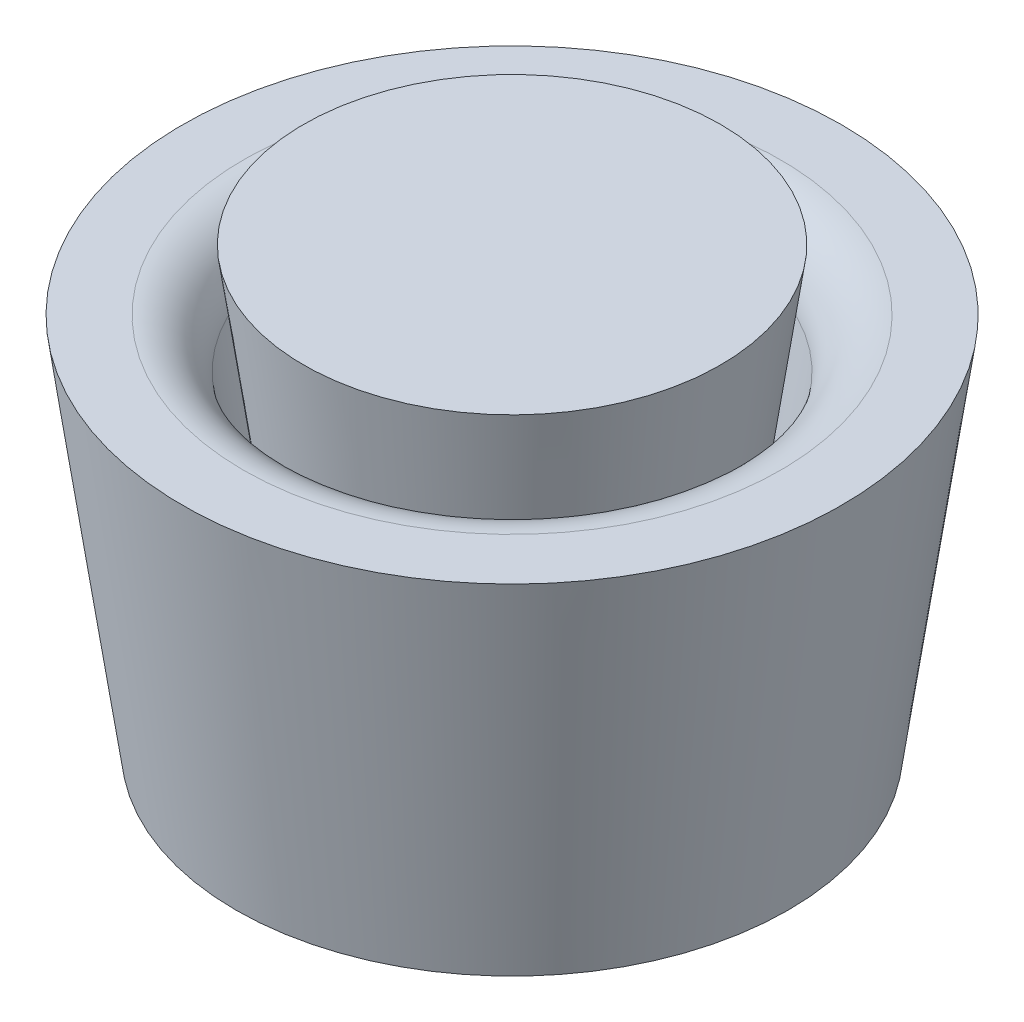
ISO-10303-21;
HEADER;
FILE_DESCRIPTION(('STEP AP214'),'2;1');
FILE_NAME('part.step','',(''),(''),'','','');
FILE_SCHEMA(('AUTOMOTIVE_DESIGN { 1 0 10303 214 1 1 1 1 }'));
ENDSEC;
DATA;
#1=APPLICATION_CONTEXT('core data for automotive mechanical design processes');
#2=APPLICATION_PROTOCOL_DEFINITION('international standard','automotive_design',2000,#1);
#3=PRODUCT_CONTEXT('',#1,'mechanical');
#4=PRODUCT('Part','Part','',(#3));
#5=PRODUCT_RELATED_PRODUCT_CATEGORY('part','',(#4));
#6=PRODUCT_DEFINITION_FORMATION('','',#4);
#7=PRODUCT_DEFINITION_CONTEXT('part definition',#1,'design');
#8=PRODUCT_DEFINITION('design','',#6,#7);
#9=PRODUCT_DEFINITION_SHAPE('','',#8);
#10=(LENGTH_UNIT() NAMED_UNIT(*) SI_UNIT(.MILLI.,.METRE.));
#11=(NAMED_UNIT(*) PLANE_ANGLE_UNIT() SI_UNIT($,.RADIAN.));
#12=(NAMED_UNIT(*) SI_UNIT($,.STERADIAN.) SOLID_ANGLE_UNIT());
#13=UNCERTAINTY_MEASURE_WITH_UNIT(LENGTH_MEASURE(1.E-05),#10,'distance_accuracy_value','');
#14=(GEOMETRIC_REPRESENTATION_CONTEXT(3) GLOBAL_UNCERTAINTY_ASSIGNED_CONTEXT((#13)) GLOBAL_UNIT_ASSIGNED_CONTEXT((#10,
#11,#12)) REPRESENTATION_CONTEXT('',''));
#15=CARTESIAN_POINT('',(0.,0.,0.));
#16=DIRECTION('',(0.,0.,1.));
#17=DIRECTION('',(1.,0.,0.));
#18=AXIS2_PLACEMENT_3D('',#15,#16,#17);
#19=CARTESIAN_POINT('',(0.,23.,0.));
#20=DIRECTION('',(0.,1.,0.));
#21=DIRECTION('',(0.,0.,1.));
#22=AXIS2_PLACEMENT_3D('',#19,#20,#21);
#23=PLANE('',#22);
#24=CARTESIAN_POINT('',(0.,23.,0.));
#25=DIRECTION('',(0.,-1.,0.));
#26=DIRECTION('',(0.,0.,-1.));
#27=AXIS2_PLACEMENT_3D('',#24,#25,#26);
#28=CIRCLE('',#27,10.9420811280098);
#29=CARTESIAN_POINT('',(0.,23.,-10.9420811280098));
#30=VERTEX_POINT('',#29);
#31=EDGE_CURVE('E11',#30,#30,#28,.T.);
#32=ORIENTED_EDGE('',*,*,#31,.F.);
#33=EDGE_LOOP('',(#32));
#34=FACE_BOUND('',#33,.T.);
#35=ADVANCED_FACE('F41',(#34),#23,.T.);
#36=CARTESIAN_POINT('',(0.,3.,0.));
#37=DIRECTION('',(0.,1.,0.));
#38=DIRECTION('',(0.,0.,1.));
#39=AXIS2_PLACEMENT_3D('',#36,#37,#38);
#40=CONICAL_SURFACE('',#39,8.11423105664609,0.140461414709856);
#41=ORIENTED_EDGE('',*,*,#31,.T.);
#42=EDGE_LOOP('',(#41));
#43=FACE_BOUND('',#42,.T.);
#44=CARTESIAN_POINT('',(0.,3.,0.));
#45=DIRECTION('',(0.,-1.,0.));
#46=DIRECTION('',(0.,0.,-1.));
#47=AXIS2_PLACEMENT_3D('',#44,#45,#46);
#48=CIRCLE('',#47,8.11423105664609);
#49=CARTESIAN_POINT('',(0.,3.,-8.11423105664609));
#50=VERTEX_POINT('',#49);
#51=EDGE_CURVE('E47',#50,#50,#48,.T.);
#52=ORIENTED_EDGE('',*,*,#51,.F.);
#53=EDGE_LOOP('',(#52));
#54=FACE_BOUND('',#53,.T.);
#55=ADVANCED_FACE('F55',(#43,#54),#40,.T.);
#56=CARTESIAN_POINT('',(8.11423105664609,3.,0.));
#57=DIRECTION('',(0.,-1.,0.));
#58=DIRECTION('',(0.,0.,-1.));
#59=AXIS2_PLACEMENT_3D('',#56,#57,#58);
#60=PLANE('',#59);
#61=ORIENTED_EDGE('',*,*,#51,.T.);
#62=EDGE_LOOP('',(#61));
#63=FACE_BOUND('',#62,.T.);
#64=ADVANCED_FACE('F53',(#63),#60,.T.);
#65=CLOSED_SHELL('',(#35,#55,#64));
#66=MANIFOLD_SOLID_BREP('B2',#65);
#67=CARTESIAN_POINT('',(0.,0.,0.));
#68=DIRECTION('',(0.,-1.,0.));
#69=DIRECTION('',(0.,0.,-1.));
#70=AXIS2_PLACEMENT_3D('',#67,#68,#69);
#71=CYLINDRICAL_SURFACE('',#70,8.7);
#72=DIRECTION('',(0.,-1.,0.));
#73=VECTOR('',#72,1.);
#74=CARTESIAN_POINT('',(6.15182899632295,0.,-6.15182899632297));
#75=LINE('',#74,#73);
#76=CARTESIAN_POINT('',(6.15182899632295,-0.799999999999999,-6.15182899632297));
#77=VERTEX_POINT('',#76);
#78=CARTESIAN_POINT('',(6.15182899632295,-0.351732015752676,-6.15182899632297));
#79=VERTEX_POINT('',#78);
#80=EDGE_CURVE('E206',#77,#79,#75,.F.);
#81=ORIENTED_EDGE('',*,*,#80,.F.);
#82=CARTESIAN_POINT('',(0.,-0.8,0.));
#83=DIRECTION('',(0.,-1.,0.));
#84=DIRECTION('',(0.,0.,-1.));
#85=AXIS2_PLACEMENT_3D('',#82,#83,#84);
#86=CIRCLE('',#85,8.7);
#87=CARTESIAN_POINT('',(6.15182899632299,-0.799999999999999,6.15182899632293));
#88=VERTEX_POINT('',#87);
#89=EDGE_CURVE('E166',#77,#88,#86,.T.);
#90=ORIENTED_EDGE('',*,*,#89,.T.);
#91=DIRECTION('',(0.,-1.,0.));
#92=VECTOR('',#91,1.);
#93=CARTESIAN_POINT('',(6.15182899632299,0.,6.15182899632293));
#94=LINE('',#93,#92);
#95=CARTESIAN_POINT('',(6.15182899632299,-0.351732015752676,6.15182899632293));
#96=VERTEX_POINT('',#95);
#97=EDGE_CURVE('E147',#96,#88,#94,.T.);
#98=ORIENTED_EDGE('',*,*,#97,.F.);
#99=CARTESIAN_POINT('',(0.,-0.351732015752676,0.));
#100=DIRECTION('',(0.,1.,0.));
#101=DIRECTION('',(0.,0.,1.));
#102=AXIS2_PLACEMENT_3D('',#99,#100,#101);
#103=CIRCLE('',#102,8.7);
#104=EDGE_CURVE('E187',#96,#79,#103,.T.);
#105=ORIENTED_EDGE('',*,*,#104,.T.);
#106=EDGE_LOOP('',(#81,#90,#98,#105));
#107=FACE_BOUND('',#106,.T.);
#108=ADVANCED_FACE('F82',(#107),#71,.F.);
#109=CARTESIAN_POINT('',(0.,19.8030300711785,0.));
#110=DIRECTION('',(0.,1.,0.));
#111=DIRECTION('',(0.,0.,1.));
#112=AXIS2_PLACEMENT_3D('',#109,#110,#111);
#113=CONICAL_SURFACE('',#112,11.5,0.140461414709856);
#114=DIRECTION('',(-0.0989949493661173,-0.990151503558925,-0.0989949493661162));
#115=VECTOR('',#114,1.);
#116=CARTESIAN_POINT('',(0.,-61.5308434354474,0.));
#117=LINE('',#116,#115);
#118=CARTESIAN_POINT('',(6.9264325798115,7.74761649724918,6.92643257981143));
#119=VERTEX_POINT('',#118);
#120=CARTESIAN_POINT('',(6.18664868941287,0.348267984247336,6.18664868941281));
#121=VERTEX_POINT('',#120);
#122=EDGE_CURVE('E97',#119,#121,#117,.T.);
#123=ORIENTED_EDGE('',*,*,#122,.F.);
#124=CARTESIAN_POINT('',(0.,7.74761649724918,0.));
#125=DIRECTION('',(0.,1.,0.));
#126=DIRECTION('',(0.,0.,1.));
#127=AXIS2_PLACEMENT_3D('',#124,#125,#126);
#128=CIRCLE('',#127,9.79545489323224);
#129=CARTESIAN_POINT('',(6.92643257981145,7.7476164972492,-6.92643257981148));
#130=VERTEX_POINT('',#129);
#131=EDGE_CURVE('E197',#119,#130,#128,.F.);
#132=ORIENTED_EDGE('',*,*,#131,.T.);
#133=DIRECTION('',(0.0989949493661166,0.990151503558925,-0.0989949493661169));
#134=VECTOR('',#133,1.);
#135=CARTESIAN_POINT('',(0.,-61.5308434354474,0.));
#136=LINE('',#135,#134);
#137=CARTESIAN_POINT('',(6.18664868941283,0.348267984247336,-6.18664868941285));
#138=VERTEX_POINT('',#137);
#139=EDGE_CURVE('E104',#138,#130,#136,.T.);
#140=ORIENTED_EDGE('',*,*,#139,.F.);
#141=CARTESIAN_POINT('',(0.,0.348267984247336,0.));
#142=DIRECTION('',(0.,-1.,0.));
#143=DIRECTION('',(0.,0.,-1.));
#144=AXIS2_PLACEMENT_3D('',#141,#142,#143);
#145=CIRCLE('',#144,8.74924248220537);
#146=EDGE_CURVE('E185',#138,#121,#145,.T.);
#147=ORIENTED_EDGE('',*,*,#146,.T.);
#148=EDGE_LOOP('',(#123,#132,#140,#147));
#149=FACE_BOUND('',#148,.T.);
#150=CARTESIAN_POINT('',(0.,17.2230300711785,0.));
#151=DIRECTION('',(0.,-1.,0.));
#152=DIRECTION('',(0.,0.,-1.));
#153=AXIS2_PLACEMENT_3D('',#150,#151,#152);
#154=CIRCLE('',#153,11.1352073407941);
#155=CARTESIAN_POINT('',(0.,17.2230300711785,-11.1352073407941));
#156=VERTEX_POINT('',#155);
#157=EDGE_CURVE('E182',#156,#156,#154,.F.);
#158=ORIENTED_EDGE('',*,*,#157,.T.);
#159=EDGE_LOOP('',(#158));
#160=FACE_BOUND('',#159,.T.);
#161=ADVANCED_FACE('F203',(#149,#160),#113,.F.);
#162=CARTESIAN_POINT('',(11.5,19.8030300711785,0.));
#163=DIRECTION('',(0.,1.,0.));
#164=DIRECTION('',(0.,0.,1.));
#165=AXIS2_PLACEMENT_3D('',#162,#163,#164);
#166=PLANE('',#165);
#167=CARTESIAN_POINT('',(0.,19.8030300711785,0.));
#168=DIRECTION('',(0.,1.,0.));
#169=DIRECTION('',(0.,0.,1.));
#170=AXIS2_PLACEMENT_3D('',#167,#168,#169);
#171=CIRCLE('',#170,14.1056618514709);
#172=CARTESIAN_POINT('',(0.,19.8030300711785,14.1056618514709));
#173=VERTEX_POINT('',#172);
#174=EDGE_CURVE('E179',#173,#173,#171,.F.);
#175=ORIENTED_EDGE('',*,*,#174,.T.);
#176=EDGE_LOOP('',(#175));
#177=FACE_BOUND('',#176,.T.);
#178=CARTESIAN_POINT('',(0.,19.8030300711785,0.));
#179=DIRECTION('',(0.,-1.,0.));
#180=DIRECTION('',(0.,0.,-1.));
#181=AXIS2_PLACEMENT_3D('',#178,#179,#180);
#182=CIRCLE('',#181,17.3);
#183=CARTESIAN_POINT('',(0.,19.8030300711785,-17.3));
#184=VERTEX_POINT('',#183);
#185=EDGE_CURVE('E176',#184,#184,#182,.T.);
#186=ORIENTED_EDGE('',*,*,#185,.F.);
#187=EDGE_LOOP('',(#186));
#188=FACE_BOUND('',#187,.T.);
#189=ADVANCED_FACE('F235',(#177,#188),#166,.T.);
#190=CARTESIAN_POINT('',(0.,0.,0.));
#191=DIRECTION('',(0.,1.,0.));
#192=DIRECTION('',(0.,0.,1.));
#193=AXIS2_PLACEMENT_3D('',#190,#191,#192);
#194=CONICAL_SURFACE('',#193,14.5,0.140461414709856);
#195=ORIENTED_EDGE('',*,*,#185,.T.);
#196=EDGE_LOOP('',(#195));
#197=FACE_BOUND('',#196,.T.);
#198=CARTESIAN_POINT('',(0.,0.,0.));
#199=DIRECTION('',(0.,-1.,0.));
#200=DIRECTION('',(0.,0.,-1.));
#201=AXIS2_PLACEMENT_3D('',#198,#199,#200);
#202=CIRCLE('',#201,14.5);
#203=CARTESIAN_POINT('',(0.,0.,-14.5));
#204=VERTEX_POINT('',#203);
#205=EDGE_CURVE('E168',#204,#204,#202,.T.);
#206=ORIENTED_EDGE('',*,*,#205,.F.);
#207=EDGE_LOOP('',(#206));
#208=FACE_BOUND('',#207,.T.);
#209=ADVANCED_FACE('F227',(#197,#208),#194,.T.);
#210=CARTESIAN_POINT('',(14.5,0.,0.));
#211=DIRECTION('',(0.,-1.,0.));
#212=DIRECTION('',(0.,0.,-1.));
#213=AXIS2_PLACEMENT_3D('',#210,#211,#212);
#214=PLANE('',#213);
#215=ORIENTED_EDGE('',*,*,#205,.T.);
#216=EDGE_LOOP('',(#215));
#217=FACE_BOUND('',#216,.T.);
#218=CARTESIAN_POINT('',(0.,0.,0.));
#219=DIRECTION('',(0.,-1.,0.));
#220=DIRECTION('',(0.,0.,-1.));
#221=AXIS2_PLACEMENT_3D('',#218,#219,#220);
#222=CIRCLE('',#221,9.5);
#223=CARTESIAN_POINT('',(6.71751442127219,0.,-6.71751442127221));
#224=VERTEX_POINT('',#223);
#225=CARTESIAN_POINT('',(6.71751442127224,0.,6.71751442127217));
#226=VERTEX_POINT('',#225);
#227=EDGE_CURVE('E161',#224,#226,#222,.T.);
#228=ORIENTED_EDGE('',*,*,#227,.F.);
#229=CARTESIAN_POINT('',(0.,0.,0.));
#230=DIRECTION('',(0.,-1.,0.));
#231=DIRECTION('',(0.,0.,-1.));
#232=AXIS2_PLACEMENT_3D('',#229,#230,#231);
#233=CIRCLE('',#232,9.5);
#234=EDGE_CURVE('E170',#226,#224,#233,.T.);
#235=ORIENTED_EDGE('',*,*,#234,.F.);
#236=EDGE_LOOP('',(#228,#235));
#237=FACE_BOUND('',#236,.T.);
#238=ADVANCED_FACE('F225',(#217,#237),#214,.T.);
#239=CARTESIAN_POINT('',(0.,0.,0.));
#240=DIRECTION('',(0.,-1.,0.));
#241=DIRECTION('',(0.,0.,-1.));
#242=AXIS2_PLACEMENT_3D('',#239,#240,#241);
#243=CYLINDRICAL_SURFACE('',#242,9.5);
#244=DIRECTION('',(0.,-1.,0.));
#245=VECTOR('',#244,1.);
#246=CARTESIAN_POINT('',(6.71751442127219,23.,-6.71751442127221));
#247=LINE('',#246,#245);
#248=CARTESIAN_POINT('',(6.71751442127219,-0.799999999999999,-6.71751442127221));
#249=VERTEX_POINT('',#248);
#250=EDGE_CURVE('E223',#224,#249,#247,.T.);
#251=ORIENTED_EDGE('',*,*,#250,.F.);
#252=ORIENTED_EDGE('',*,*,#227,.T.);
#253=DIRECTION('',(0.,-1.,0.));
#254=VECTOR('',#253,1.);
#255=CARTESIAN_POINT('',(6.71751442127224,23.,6.71751442127217));
#256=LINE('',#255,#254);
#257=CARTESIAN_POINT('',(6.71751442127224,-0.799999999999999,6.71751442127217));
#258=VERTEX_POINT('',#257);
#259=EDGE_CURVE('E144',#226,#258,#256,.T.);
#260=ORIENTED_EDGE('',*,*,#259,.T.);
#261=CARTESIAN_POINT('',(0.,-0.799999999999999,0.));
#262=DIRECTION('',(0.,-1.,0.));
#263=DIRECTION('',(0.,0.,-1.));
#264=AXIS2_PLACEMENT_3D('',#261,#262,#263);
#265=CIRCLE('',#264,9.5);
#266=EDGE_CURVE('E159',#249,#258,#265,.T.);
#267=ORIENTED_EDGE('',*,*,#266,.F.);
#268=EDGE_LOOP('',(#251,#252,#260,#267));
#269=FACE_BOUND('',#268,.T.);
#270=ADVANCED_FACE('F158',(#269),#243,.T.);
#271=CARTESIAN_POINT('',(9.5,-0.799999999999999,0.));
#272=DIRECTION('',(0.,-1.,0.));
#273=DIRECTION('',(0.,0.,-1.));
#274=AXIS2_PLACEMENT_3D('',#271,#272,#273);
#275=PLANE('',#274);
#276=DIRECTION('',(-0.707106781186546,0.,0.707106781186549));
#277=VECTOR('',#276,1.);
#278=CARTESIAN_POINT('',(6.71751442127219,-0.799999999999999,-6.71751442127221));
#279=LINE('',#278,#277);
#280=EDGE_CURVE('E152',#249,#77,#279,.T.);
#281=ORIENTED_EDGE('',*,*,#280,.F.);
#282=ORIENTED_EDGE('',*,*,#266,.T.);
#283=DIRECTION('',(0.707106781186551,0.,0.707106781186544));
#284=VECTOR('',#283,1.);
#285=CARTESIAN_POINT('',(0.,-0.799999999999999,0.));
#286=LINE('',#285,#284);
#287=EDGE_CURVE('E140',#88,#258,#286,.T.);
#288=ORIENTED_EDGE('',*,*,#287,.F.);
#289=ORIENTED_EDGE('',*,*,#89,.F.);
#290=EDGE_LOOP('',(#281,#282,#288,#289));
#291=FACE_BOUND('',#290,.T.);
#292=ADVANCED_FACE('F165',(#291),#275,.T.);
#293=CARTESIAN_POINT('',(0.,16.8030300711785,0.));
#294=DIRECTION('',(0.,1.,0.));
#295=DIRECTION('',(0.,0.,1.));
#296=AXIS2_PLACEMENT_3D('',#293,#294,#295);
#297=TOROIDAL_SURFACE('',#296,14.1056618514709,3.);
#298=ORIENTED_EDGE('',*,*,#157,.F.);
#299=EDGE_LOOP('',(#298));
#300=FACE_BOUND('',#299,.T.);
#301=ORIENTED_EDGE('',*,*,#174,.F.);
#302=EDGE_LOOP('',(#301));
#303=FACE_BOUND('',#302,.T.);
#304=ADVANCED_FACE('F246',(#300,#303),#297,.T.);
#305=CARTESIAN_POINT('',(0.,-0.351732015752676,0.));
#306=DIRECTION('',(0.,1.,0.));
#307=DIRECTION('',(0.,0.,1.));
#308=AXIS2_PLACEMENT_3D('',#305,#306,#307);
#309=TOROIDAL_SURFACE('',#308,13.7,5.);
#310=CARTESIAN_POINT('',(9.68736290225569,-0.351732015752676,-9.68736290225571));
#311=DIRECTION('',(0.707106781186549,0.,0.707106781186546));
#312=DIRECTION('',(0.707106781186546,0.,-0.707106781186549));
#313=AXIS2_PLACEMENT_3D('',#310,#311,#312);
#314=CIRCLE('',#313,5.);
#315=EDGE_CURVE('E192',#79,#138,#314,.F.);
#316=ORIENTED_EDGE('',*,*,#315,.F.);
#317=ORIENTED_EDGE('',*,*,#104,.F.);
#318=CARTESIAN_POINT('',(9.68736290225575,-0.351732015752676,9.68736290225565));
#319=DIRECTION('',(0.707106781186544,0.,-0.707106781186551));
#320=DIRECTION('',(-0.707106781186551,0.,-0.707106781186544));
#321=AXIS2_PLACEMENT_3D('',#318,#319,#320);
#322=CIRCLE('',#321,5.);
#323=EDGE_CURVE('E190',#121,#96,#322,.F.);
#324=ORIENTED_EDGE('',*,*,#323,.F.);
#325=ORIENTED_EDGE('',*,*,#146,.F.);
#326=EDGE_LOOP('',(#316,#317,#324,#325));
#327=FACE_BOUND('',#326,.T.);
#328=ADVANCED_FACE('F210',(#327),#309,.T.);
#329=CARTESIAN_POINT('',(6.71751442127219,23.,-6.71751442127221));
#330=DIRECTION('',(0.707106781186549,0.,0.707106781186546));
#331=DIRECTION('',(0.707106781186546,0.,-0.707106781186549));
#332=AXIS2_PLACEMENT_3D('',#329,#330,#331);
#333=PLANE('',#332);
#334=ORIENTED_EDGE('',*,*,#80,.T.);
#335=ORIENTED_EDGE('',*,*,#315,.T.);
#336=ORIENTED_EDGE('',*,*,#139,.T.);
#337=CARTESIAN_POINT('',(27.9307178568686,3.54761649724917,-27.9307178568687));
#338=DIRECTION('',(0.707106781186549,0.,0.707106781186546));
#339=DIRECTION('',(0.707106781186546,0.,-0.707106781186549));
#340=AXIS2_PLACEMENT_3D('',#337,#338,#339);
#341=CIRCLE('',#340,30.);
#342=CARTESIAN_POINT('',(6.71751442127219,3.54761649724918,-6.71751442127221));
#343=VERTEX_POINT('',#342);
#344=EDGE_CURVE('E39',#130,#343,#341,.T.);
#345=ORIENTED_EDGE('',*,*,#344,.T.);
#346=EDGE_CURVE('E215',#343,#224,#247,.T.);
#347=ORIENTED_EDGE('',*,*,#346,.T.);
#348=ORIENTED_EDGE('',*,*,#250,.T.);
#349=ORIENTED_EDGE('',*,*,#280,.T.);
#350=EDGE_LOOP('',(#334,#335,#336,#345,#347,#348,#349));
#351=FACE_BOUND('',#350,.T.);
#352=ADVANCED_FACE('F250',(#351),#333,.F.);
#353=CARTESIAN_POINT('',(0.,23.,0.));
#354=DIRECTION('',(0.,-1.,0.));
#355=DIRECTION('',(0.,0.,-1.));
#356=AXIS2_PLACEMENT_3D('',#353,#354,#355);
#357=CYLINDRICAL_SURFACE('',#356,9.5);
#358=ORIENTED_EDGE('',*,*,#346,.F.);
#359=CARTESIAN_POINT('',(0.,3.54761649724918,0.));
#360=DIRECTION('',(0.,-1.,0.));
#361=DIRECTION('',(0.,0.,-1.));
#362=AXIS2_PLACEMENT_3D('',#359,#360,#361);
#363=CIRCLE('',#362,9.5);
#364=CARTESIAN_POINT('',(6.71751442127224,3.54761649724918,6.71751442127217));
#365=VERTEX_POINT('',#364);
#366=EDGE_CURVE('E194',#343,#365,#363,.F.);
#367=ORIENTED_EDGE('',*,*,#366,.T.);
#368=EDGE_CURVE('E162',#365,#226,#256,.T.);
#369=ORIENTED_EDGE('',*,*,#368,.T.);
#370=ORIENTED_EDGE('',*,*,#234,.T.);
#371=EDGE_LOOP('',(#358,#367,#369,#370));
#372=FACE_BOUND('',#371,.T.);
#373=ADVANCED_FACE('F221',(#372),#357,.F.);
#374=CARTESIAN_POINT('',(0.,23.,0.));
#375=DIRECTION('',(0.707106781186544,0.,-0.707106781186551));
#376=DIRECTION('',(-0.707106781186551,0.,-0.707106781186544));
#377=AXIS2_PLACEMENT_3D('',#374,#375,#376);
#378=PLANE('',#377);
#379=ORIENTED_EDGE('',*,*,#97,.T.);
#380=ORIENTED_EDGE('',*,*,#287,.T.);
#381=ORIENTED_EDGE('',*,*,#259,.F.);
#382=ORIENTED_EDGE('',*,*,#368,.F.);
#383=CARTESIAN_POINT('',(27.9307178568688,3.54761649724917,27.9307178568685));
#384=DIRECTION('',(0.707106781186544,0.,-0.707106781186551));
#385=DIRECTION('',(-0.707106781186551,0.,-0.707106781186544));
#386=AXIS2_PLACEMENT_3D('',#383,#384,#385);
#387=CIRCLE('',#386,30.);
#388=EDGE_CURVE('E90',#365,#119,#387,.T.);
#389=ORIENTED_EDGE('',*,*,#388,.T.);
#390=ORIENTED_EDGE('',*,*,#122,.T.);
#391=ORIENTED_EDGE('',*,*,#323,.T.);
#392=EDGE_LOOP('',(#379,#380,#381,#382,#389,#390,#391));
#393=FACE_BOUND('',#392,.T.);
#394=ADVANCED_FACE('F142',(#393),#378,.F.);
#395=CARTESIAN_POINT('',(0.,3.54761649724917,0.));
#396=DIRECTION('',(0.,-1.,0.));
#397=DIRECTION('',(0.,0.,-1.));
#398=AXIS2_PLACEMENT_3D('',#395,#396,#397);
#399=TOROIDAL_SURFACE('',#398,39.5,30.);
#400=ORIENTED_EDGE('',*,*,#344,.F.);
#401=ORIENTED_EDGE('',*,*,#131,.F.);
#402=ORIENTED_EDGE('',*,*,#388,.F.);
#403=ORIENTED_EDGE('',*,*,#366,.F.);
#404=EDGE_LOOP('',(#400,#401,#402,#403));
#405=FACE_BOUND('',#404,.T.);
#406=ADVANCED_FACE('F84',(#405),#399,.T.);
#407=CLOSED_SHELL('',(#108,#161,#189,#209,#238,#270,#292,#304,#328,#352,#373,#394,#406));
#408=MANIFOLD_SOLID_BREP('B6',#407);
#409=ADVANCED_BREP_SHAPE_REPRESENTATION('',(#18,#66,#408),#14);
#410=SHAPE_DEFINITION_REPRESENTATION(#9,#409);
ENDSEC;
END-ISO-10303-21;
